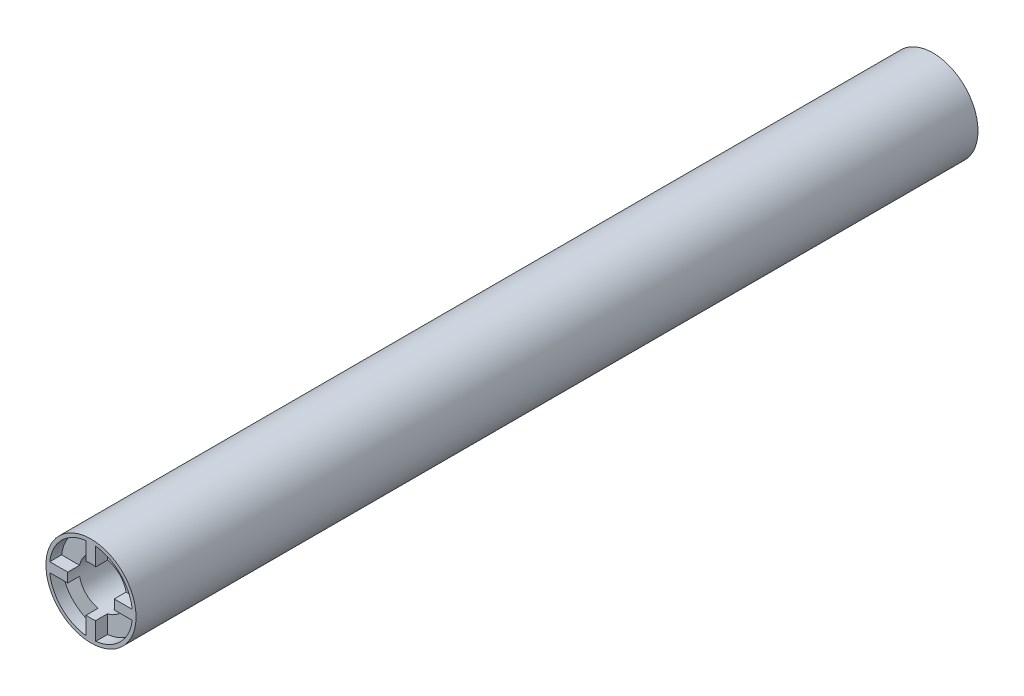
ISO-10303-21;
HEADER;
FILE_DESCRIPTION(('STEP AP214'),'2;1');
FILE_NAME('part.step','',(''),(''),'','','');
FILE_SCHEMA(('AUTOMOTIVE_DESIGN { 1 0 10303 214 1 1 1 1 }'));
ENDSEC;
DATA;
#1=APPLICATION_CONTEXT('core data for automotive mechanical design processes');
#2=APPLICATION_PROTOCOL_DEFINITION('international standard','automotive_design',2000,#1);
#3=PRODUCT_CONTEXT('',#1,'mechanical');
#4=PRODUCT('Part','Part','',(#3));
#5=PRODUCT_RELATED_PRODUCT_CATEGORY('part','',(#4));
#6=PRODUCT_DEFINITION_FORMATION('','',#4);
#7=PRODUCT_DEFINITION_CONTEXT('part definition',#1,'design');
#8=PRODUCT_DEFINITION('design','',#6,#7);
#9=PRODUCT_DEFINITION_SHAPE('','',#8);
#10=(LENGTH_UNIT() NAMED_UNIT(*) SI_UNIT(.MILLI.,.METRE.));
#11=(NAMED_UNIT(*) PLANE_ANGLE_UNIT() SI_UNIT($,.RADIAN.));
#12=(NAMED_UNIT(*) SI_UNIT($,.STERADIAN.) SOLID_ANGLE_UNIT());
#13=UNCERTAINTY_MEASURE_WITH_UNIT(LENGTH_MEASURE(1.E-05),#10,'distance_accuracy_value','');
#14=(GEOMETRIC_REPRESENTATION_CONTEXT(3) GLOBAL_UNCERTAINTY_ASSIGNED_CONTEXT((#13)) GLOBAL_UNIT_ASSIGNED_CONTEXT((#10,
#11,#12)) REPRESENTATION_CONTEXT('',''));
#15=CARTESIAN_POINT('',(0.,0.,0.));
#16=DIRECTION('',(0.,0.,1.));
#17=DIRECTION('',(1.,0.,0.));
#18=AXIS2_PLACEMENT_3D('',#15,#16,#17);
#19=CARTESIAN_POINT('',(0.,0.,0.));
#20=DIRECTION('',(0.,0.,1.));
#21=DIRECTION('',(1.,0.,0.));
#22=AXIS2_PLACEMENT_3D('',#19,#20,#21);
#23=PLANE('',#22);
#24=CARTESIAN_POINT('',(0.,0.,0.));
#25=DIRECTION('',(0.,0.,1.));
#26=DIRECTION('',(1.,0.,0.));
#27=AXIS2_PLACEMENT_3D('',#24,#25,#26);
#28=CIRCLE('',#27,1.);
#29=CARTESIAN_POINT('',(0.2,-0.979795897113271,0.));
#30=VERTEX_POINT('',#29);
#31=CARTESIAN_POINT('',(0.979795897113271,-0.2,0.));
#32=VERTEX_POINT('',#31);
#33=EDGE_CURVE('E157',#30,#32,#28,.T.);
#34=ORIENTED_EDGE('',*,*,#33,.F.);
#35=DIRECTION('',(0.,-1.,0.));
#36=VECTOR('',#35,1.);
#37=CARTESIAN_POINT('',(0.2,0.,0.));
#38=LINE('',#37,#36);
#39=CARTESIAN_POINT('',(0.2,-1.73853386507137,0.));
#40=VERTEX_POINT('',#39);
#41=EDGE_CURVE('E50',#30,#40,#38,.T.);
#42=ORIENTED_EDGE('',*,*,#41,.T.);
#43=CARTESIAN_POINT('',(0.,0.,0.));
#44=DIRECTION('',(0.,0.,1.));
#45=DIRECTION('',(1.,0.,0.));
#46=AXIS2_PLACEMENT_3D('',#43,#44,#45);
#47=CIRCLE('',#46,1.75);
#48=CARTESIAN_POINT('',(1.73853386507137,-0.2,0.));
#49=VERTEX_POINT('',#48);
#50=EDGE_CURVE('E55',#40,#49,#47,.T.);
#51=ORIENTED_EDGE('',*,*,#50,.T.);
#52=DIRECTION('',(1.,0.,0.));
#53=VECTOR('',#52,1.);
#54=CARTESIAN_POINT('',(0.,-0.2,0.));
#55=LINE('',#54,#53);
#56=EDGE_CURVE('E230',#32,#49,#55,.T.);
#57=ORIENTED_EDGE('',*,*,#56,.F.);
#58=EDGE_LOOP('',(#34,#42,#51,#57));
#59=FACE_BOUND('',#58,.T.);
#60=ADVANCED_FACE('F35',(#59),#23,.T.);
#61=CARTESIAN_POINT('',(0.979795897113271,0.2,0.));
#62=VERTEX_POINT('',#61);
#63=CARTESIAN_POINT('',(0.2,0.979795897113271,0.));
#64=VERTEX_POINT('',#63);
#65=EDGE_CURVE('E277',#62,#64,#28,.T.);
#66=ORIENTED_EDGE('',*,*,#65,.F.);
#67=DIRECTION('',(1.,0.,0.));
#68=VECTOR('',#67,1.);
#69=CARTESIAN_POINT('',(0.,0.2,0.));
#70=LINE('',#69,#68);
#71=CARTESIAN_POINT('',(1.73853386507137,0.2,0.));
#72=VERTEX_POINT('',#71);
#73=EDGE_CURVE('E228',#62,#72,#70,.T.);
#74=ORIENTED_EDGE('',*,*,#73,.T.);
#75=CARTESIAN_POINT('',(0.,0.,0.));
#76=DIRECTION('',(0.,0.,1.));
#77=DIRECTION('',(1.,0.,0.));
#78=AXIS2_PLACEMENT_3D('',#75,#76,#77);
#79=CIRCLE('',#78,1.75);
#80=CARTESIAN_POINT('',(0.2,1.73853386507137,0.));
#81=VERTEX_POINT('',#80);
#82=EDGE_CURVE('E226',#72,#81,#79,.T.);
#83=ORIENTED_EDGE('',*,*,#82,.T.);
#84=DIRECTION('',(0.,-1.,0.));
#85=VECTOR('',#84,1.);
#86=CARTESIAN_POINT('',(0.2,0.,0.));
#87=LINE('',#86,#85);
#88=EDGE_CURVE('E224',#81,#64,#87,.T.);
#89=ORIENTED_EDGE('',*,*,#88,.T.);
#90=EDGE_LOOP('',(#66,#74,#83,#89));
#91=FACE_BOUND('',#90,.T.);
#92=ADVANCED_FACE('F303',(#91),#23,.T.);
#93=DIRECTION('',(0.,-1.,0.));
#94=VECTOR('',#93,1.);
#95=CARTESIAN_POINT('',(-0.2,0.,0.));
#96=LINE('',#95,#94);
#97=CARTESIAN_POINT('',(-0.2,1.73853386507137,0.));
#98=VERTEX_POINT('',#97);
#99=CARTESIAN_POINT('',(-0.2,0.979795897113271,0.));
#100=VERTEX_POINT('',#99);
#101=EDGE_CURVE('E221',#98,#100,#96,.T.);
#102=ORIENTED_EDGE('',*,*,#101,.F.);
#103=CARTESIAN_POINT('',(0.,0.,0.));
#104=DIRECTION('',(0.,0.,1.));
#105=DIRECTION('',(1.,0.,0.));
#106=AXIS2_PLACEMENT_3D('',#103,#104,#105);
#107=CIRCLE('',#106,1.75);
#108=CARTESIAN_POINT('',(-1.73853386507137,0.2,0.));
#109=VERTEX_POINT('',#108);
#110=EDGE_CURVE('E219',#98,#109,#107,.T.);
#111=ORIENTED_EDGE('',*,*,#110,.T.);
#112=DIRECTION('',(1.,0.,0.));
#113=VECTOR('',#112,1.);
#114=CARTESIAN_POINT('',(0.,0.2,0.));
#115=LINE('',#114,#113);
#116=CARTESIAN_POINT('',(-0.979795897113271,0.2,0.));
#117=VERTEX_POINT('',#116);
#118=EDGE_CURVE('E217',#109,#117,#115,.T.);
#119=ORIENTED_EDGE('',*,*,#118,.T.);
#120=EDGE_CURVE('E279',#100,#117,#28,.T.);
#121=ORIENTED_EDGE('',*,*,#120,.F.);
#122=EDGE_LOOP('',(#102,#111,#119,#121));
#123=FACE_BOUND('',#122,.T.);
#124=ADVANCED_FACE('F308',(#123),#23,.T.);
#125=DIRECTION('',(0.,-1.,0.));
#126=VECTOR('',#125,1.);
#127=CARTESIAN_POINT('',(-0.2,0.,0.));
#128=LINE('',#127,#126);
#129=CARTESIAN_POINT('',(-0.2,-0.979795897113271,0.));
#130=VERTEX_POINT('',#129);
#131=CARTESIAN_POINT('',(-0.2,-1.73853386507137,0.));
#132=VERTEX_POINT('',#131);
#133=EDGE_CURVE('E175',#130,#132,#128,.T.);
#134=ORIENTED_EDGE('',*,*,#133,.F.);
#135=CARTESIAN_POINT('',(-0.979795897113271,-0.2,0.));
#136=VERTEX_POINT('',#135);
#137=EDGE_CURVE('E283',#136,#130,#28,.T.);
#138=ORIENTED_EDGE('',*,*,#137,.F.);
#139=DIRECTION('',(1.,0.,0.));
#140=VECTOR('',#139,1.);
#141=CARTESIAN_POINT('',(0.,-0.2,0.));
#142=LINE('',#141,#140);
#143=CARTESIAN_POINT('',(-1.73853386507137,-0.2,0.));
#144=VERTEX_POINT('',#143);
#145=EDGE_CURVE('E215',#144,#136,#142,.T.);
#146=ORIENTED_EDGE('',*,*,#145,.F.);
#147=CARTESIAN_POINT('',(0.,0.,0.));
#148=DIRECTION('',(0.,0.,1.));
#149=DIRECTION('',(1.,0.,0.));
#150=AXIS2_PLACEMENT_3D('',#147,#148,#149);
#151=CIRCLE('',#150,1.75);
#152=EDGE_CURVE('E154',#144,#132,#151,.T.);
#153=ORIENTED_EDGE('',*,*,#152,.T.);
#154=EDGE_LOOP('',(#134,#138,#146,#153));
#155=FACE_BOUND('',#154,.T.);
#156=ADVANCED_FACE('F304',(#155),#23,.T.);
#157=CARTESIAN_POINT('',(0.,0.,-8.));
#158=DIRECTION('',(0.,0.,1.));
#159=DIRECTION('',(1.,0.,0.));
#160=AXIS2_PLACEMENT_3D('',#157,#158,#159);
#161=CYLINDRICAL_SURFACE('',#160,1.);
#162=CARTESIAN_POINT('',(0.,0.,-8.));
#163=DIRECTION('',(0.,0.,1.));
#164=DIRECTION('',(1.,0.,0.));
#165=AXIS2_PLACEMENT_3D('',#162,#163,#164);
#166=CIRCLE('',#165,1.);
#167=CARTESIAN_POINT('',(1.,0.,-8.));
#168=VERTEX_POINT('',#167);
#169=EDGE_CURVE('E43',#168,#168,#166,.T.);
#170=ORIENTED_EDGE('',*,*,#169,.F.);
#171=EDGE_LOOP('',(#170));
#172=FACE_BOUND('',#171,.T.);
#173=ORIENTED_EDGE('',*,*,#65,.T.);
#174=DIRECTION('',(0.,0.,-1.));
#175=VECTOR('',#174,1.);
#176=CARTESIAN_POINT('',(0.2,0.979795897113271,0.5));
#177=LINE('',#176,#175);
#178=CARTESIAN_POINT('',(0.2,0.979795897113271,0.5));
#179=VERTEX_POINT('',#178);
#180=EDGE_CURVE('E260',#179,#64,#177,.T.);
#181=ORIENTED_EDGE('',*,*,#180,.F.);
#182=CARTESIAN_POINT('',(0.,0.,0.5));
#183=DIRECTION('',(0.,0.,1.));
#184=DIRECTION('',(1.,0.,0.));
#185=AXIS2_PLACEMENT_3D('',#182,#183,#184);
#186=CIRCLE('',#185,1.);
#187=CARTESIAN_POINT('',(-0.2,0.979795897113271,0.5));
#188=VERTEX_POINT('',#187);
#189=EDGE_CURVE('E188',#188,#179,#186,.F.);
#190=ORIENTED_EDGE('',*,*,#189,.F.);
#191=DIRECTION('',(0.,0.,-1.));
#192=VECTOR('',#191,1.);
#193=CARTESIAN_POINT('',(-0.2,0.979795897113271,0.5));
#194=LINE('',#193,#192);
#195=EDGE_CURVE('E263',#188,#100,#194,.T.);
#196=ORIENTED_EDGE('',*,*,#195,.T.);
#197=ORIENTED_EDGE('',*,*,#120,.T.);
#198=DIRECTION('',(0.,0.,-1.));
#199=VECTOR('',#198,1.);
#200=CARTESIAN_POINT('',(-0.979795897113271,0.2,0.5));
#201=LINE('',#200,#199);
#202=CARTESIAN_POINT('',(-0.979795897113271,0.2,0.5));
#203=VERTEX_POINT('',#202);
#204=EDGE_CURVE('E272',#203,#117,#201,.T.);
#205=ORIENTED_EDGE('',*,*,#204,.F.);
#206=CARTESIAN_POINT('',(0.,0.,0.5));
#207=DIRECTION('',(0.,0.,1.));
#208=DIRECTION('',(1.,0.,0.));
#209=AXIS2_PLACEMENT_3D('',#206,#207,#208);
#210=CIRCLE('',#209,1.);
#211=CARTESIAN_POINT('',(-0.979795897113271,-0.2,0.5));
#212=VERTEX_POINT('',#211);
#213=EDGE_CURVE('E166',#212,#203,#210,.F.);
#214=ORIENTED_EDGE('',*,*,#213,.F.);
#215=DIRECTION('',(0.,0.,-1.));
#216=VECTOR('',#215,1.);
#217=CARTESIAN_POINT('',(-0.979795897113271,-0.2,0.5));
#218=LINE('',#217,#216);
#219=EDGE_CURVE('E158',#212,#136,#218,.T.);
#220=ORIENTED_EDGE('',*,*,#219,.T.);
#221=ORIENTED_EDGE('',*,*,#137,.T.);
#222=DIRECTION('',(0.,0.,-1.));
#223=VECTOR('',#222,1.);
#224=CARTESIAN_POINT('',(-0.2,-0.979795897113271,0.5));
#225=LINE('',#224,#223);
#226=CARTESIAN_POINT('',(-0.2,-0.979795897113271,0.5));
#227=VERTEX_POINT('',#226);
#228=EDGE_CURVE('E238',#227,#130,#225,.T.);
#229=ORIENTED_EDGE('',*,*,#228,.F.);
#230=CARTESIAN_POINT('',(0.,0.,0.5));
#231=DIRECTION('',(0.,0.,1.));
#232=DIRECTION('',(1.,0.,0.));
#233=AXIS2_PLACEMENT_3D('',#230,#231,#232);
#234=CIRCLE('',#233,1.);
#235=CARTESIAN_POINT('',(0.2,-0.979795897113271,0.5));
#236=VERTEX_POINT('',#235);
#237=EDGE_CURVE('E210',#236,#227,#234,.F.);
#238=ORIENTED_EDGE('',*,*,#237,.F.);
#239=DIRECTION('',(0.,0.,-1.));
#240=VECTOR('',#239,1.);
#241=CARTESIAN_POINT('',(0.2,-0.979795897113271,0.5));
#242=LINE('',#241,#240);
#243=EDGE_CURVE('E241',#236,#30,#242,.T.);
#244=ORIENTED_EDGE('',*,*,#243,.T.);
#245=ORIENTED_EDGE('',*,*,#33,.T.);
#246=DIRECTION('',(0.,0.,-1.));
#247=VECTOR('',#246,1.);
#248=CARTESIAN_POINT('',(0.979795897113271,-0.2,0.5));
#249=LINE('',#248,#247);
#250=CARTESIAN_POINT('',(0.979795897113271,-0.2,0.5));
#251=VERTEX_POINT('',#250);
#252=EDGE_CURVE('E248',#251,#32,#249,.T.);
#253=ORIENTED_EDGE('',*,*,#252,.F.);
#254=CARTESIAN_POINT('',(0.,0.,0.5));
#255=DIRECTION('',(0.,0.,1.));
#256=DIRECTION('',(1.,0.,0.));
#257=AXIS2_PLACEMENT_3D('',#254,#255,#256);
#258=CIRCLE('',#257,1.);
#259=CARTESIAN_POINT('',(0.979795897113271,0.2,0.5));
#260=VERTEX_POINT('',#259);
#261=EDGE_CURVE('E199',#260,#251,#258,.F.);
#262=ORIENTED_EDGE('',*,*,#261,.F.);
#263=DIRECTION('',(0.,0.,-1.));
#264=VECTOR('',#263,1.);
#265=CARTESIAN_POINT('',(0.979795897113271,0.2,0.5));
#266=LINE('',#265,#264);
#267=EDGE_CURVE('E251',#260,#62,#266,.T.);
#268=ORIENTED_EDGE('',*,*,#267,.T.);
#269=EDGE_LOOP('',(#173,#181,#190,#196,#197,#205,#214,#220,#221,#229,#238,#244,#245,#253,#262,#268));
#270=FACE_BOUND('',#269,.T.);
#271=ADVANCED_FACE('F288',(#172,#270),#161,.F.);
#272=CARTESIAN_POINT('',(0.,0.,-8.));
#273=DIRECTION('',(0.,0.,1.));
#274=DIRECTION('',(1.,0.,0.));
#275=AXIS2_PLACEMENT_3D('',#272,#273,#274);
#276=PLANE('',#275);
#277=ORIENTED_EDGE('',*,*,#169,.T.);
#278=EDGE_LOOP('',(#277));
#279=FACE_BOUND('',#278,.T.);
#280=ADVANCED_FACE('F316',(#279),#276,.T.);
#281=CARTESIAN_POINT('',(0.,0.,0.5));
#282=DIRECTION('',(0.,0.,-1.));
#283=DIRECTION('',(-1.,0.,0.));
#284=AXIS2_PLACEMENT_3D('',#281,#282,#283);
#285=CYLINDRICAL_SURFACE('',#284,1.75);
#286=ORIENTED_EDGE('',*,*,#152,.F.);
#287=DIRECTION('',(0.,0.,-1.));
#288=VECTOR('',#287,1.);
#289=CARTESIAN_POINT('',(-1.73853386507137,-0.2,0.5));
#290=LINE('',#289,#288);
#291=CARTESIAN_POINT('',(-1.73853386507137,-0.2,0.5));
#292=VERTEX_POINT('',#291);
#293=EDGE_CURVE('E148',#292,#144,#290,.T.);
#294=ORIENTED_EDGE('',*,*,#293,.F.);
#295=CARTESIAN_POINT('',(0.,0.,0.5));
#296=DIRECTION('',(0.,0.,1.));
#297=DIRECTION('',(1.,0.,0.));
#298=AXIS2_PLACEMENT_3D('',#295,#296,#297);
#299=CIRCLE('',#298,1.75);
#300=CARTESIAN_POINT('',(-0.2,-1.73853386507137,0.5));
#301=VERTEX_POINT('',#300);
#302=EDGE_CURVE('E153',#292,#301,#299,.T.);
#303=ORIENTED_EDGE('',*,*,#302,.T.);
#304=DIRECTION('',(0.,0.,-1.));
#305=VECTOR('',#304,1.);
#306=CARTESIAN_POINT('',(-0.2,-1.73853386507137,0.5));
#307=LINE('',#306,#305);
#308=EDGE_CURVE('E213',#301,#132,#307,.T.);
#309=ORIENTED_EDGE('',*,*,#308,.T.);
#310=EDGE_LOOP('',(#286,#294,#303,#309));
#311=FACE_BOUND('',#310,.T.);
#312=ADVANCED_FACE('F150',(#311),#285,.F.);
#313=CARTESIAN_POINT('',(0.,-0.2,0.5));
#314=DIRECTION('',(0.,1.,0.));
#315=DIRECTION('',(-1.,0.,0.));
#316=AXIS2_PLACEMENT_3D('',#313,#314,#315);
#317=PLANE('',#316);
#318=ORIENTED_EDGE('',*,*,#145,.T.);
#319=ORIENTED_EDGE('',*,*,#219,.F.);
#320=DIRECTION('',(1.,0.,0.));
#321=VECTOR('',#320,1.);
#322=CARTESIAN_POINT('',(0.,-0.2,0.5));
#323=LINE('',#322,#321);
#324=EDGE_CURVE('E162',#292,#212,#323,.T.);
#325=ORIENTED_EDGE('',*,*,#324,.F.);
#326=ORIENTED_EDGE('',*,*,#293,.T.);
#327=EDGE_LOOP('',(#318,#319,#325,#326));
#328=FACE_BOUND('',#327,.T.);
#329=ADVANCED_FACE('F163',(#328),#317,.F.);
#330=CARTESIAN_POINT('',(0.,0.2,0.5));
#331=DIRECTION('',(0.,1.,0.));
#332=DIRECTION('',(-1.,0.,0.));
#333=AXIS2_PLACEMENT_3D('',#330,#331,#332);
#334=PLANE('',#333);
#335=ORIENTED_EDGE('',*,*,#118,.F.);
#336=DIRECTION('',(0.,0.,-1.));
#337=VECTOR('',#336,1.);
#338=CARTESIAN_POINT('',(-1.73853386507137,0.2,0.5));
#339=LINE('',#338,#337);
#340=CARTESIAN_POINT('',(-1.73853386507137,0.2,0.5));
#341=VERTEX_POINT('',#340);
#342=EDGE_CURVE('E269',#341,#109,#339,.T.);
#343=ORIENTED_EDGE('',*,*,#342,.F.);
#344=DIRECTION('',(1.,0.,0.));
#345=VECTOR('',#344,1.);
#346=CARTESIAN_POINT('',(0.,0.2,0.5));
#347=LINE('',#346,#345);
#348=EDGE_CURVE('E179',#341,#203,#347,.T.);
#349=ORIENTED_EDGE('',*,*,#348,.T.);
#350=ORIENTED_EDGE('',*,*,#204,.T.);
#351=EDGE_LOOP('',(#335,#343,#349,#350));
#352=FACE_BOUND('',#351,.T.);
#353=ADVANCED_FACE('F333',(#352),#334,.T.);
#354=CARTESIAN_POINT('',(0.,0.,0.5));
#355=DIRECTION('',(0.,0.,-1.));
#356=DIRECTION('',(-1.,0.,0.));
#357=AXIS2_PLACEMENT_3D('',#354,#355,#356);
#358=CYLINDRICAL_SURFACE('',#357,1.75);
#359=ORIENTED_EDGE('',*,*,#110,.F.);
#360=DIRECTION('',(0.,0.,-1.));
#361=VECTOR('',#360,1.);
#362=CARTESIAN_POINT('',(-0.2,1.73853386507137,0.5));
#363=LINE('',#362,#361);
#364=CARTESIAN_POINT('',(-0.2,1.73853386507137,0.5));
#365=VERTEX_POINT('',#364);
#366=EDGE_CURVE('E266',#365,#98,#363,.T.);
#367=ORIENTED_EDGE('',*,*,#366,.F.);
#368=CARTESIAN_POINT('',(0.,0.,0.5));
#369=DIRECTION('',(0.,0.,1.));
#370=DIRECTION('',(1.,0.,0.));
#371=AXIS2_PLACEMENT_3D('',#368,#369,#370);
#372=CIRCLE('',#371,1.75);
#373=EDGE_CURVE('E182',#365,#341,#372,.T.);
#374=ORIENTED_EDGE('',*,*,#373,.T.);
#375=ORIENTED_EDGE('',*,*,#342,.T.);
#376=EDGE_LOOP('',(#359,#367,#374,#375));
#377=FACE_BOUND('',#376,.T.);
#378=ADVANCED_FACE('F329',(#377),#358,.F.);
#379=CARTESIAN_POINT('',(-0.2,0.,0.5));
#380=DIRECTION('',(1.,0.,0.));
#381=DIRECTION('',(0.,1.,0.));
#382=AXIS2_PLACEMENT_3D('',#379,#380,#381);
#383=PLANE('',#382);
#384=ORIENTED_EDGE('',*,*,#101,.T.);
#385=ORIENTED_EDGE('',*,*,#195,.F.);
#386=DIRECTION('',(0.,-1.,0.));
#387=VECTOR('',#386,1.);
#388=CARTESIAN_POINT('',(-0.2,0.,0.5));
#389=LINE('',#388,#387);
#390=EDGE_CURVE('E185',#365,#188,#389,.T.);
#391=ORIENTED_EDGE('',*,*,#390,.F.);
#392=ORIENTED_EDGE('',*,*,#366,.T.);
#393=EDGE_LOOP('',(#384,#385,#391,#392));
#394=FACE_BOUND('',#393,.T.);
#395=ADVANCED_FACE('F326',(#394),#383,.F.);
#396=CARTESIAN_POINT('',(0.2,0.,0.5));
#397=DIRECTION('',(1.,0.,0.));
#398=DIRECTION('',(0.,1.,0.));
#399=AXIS2_PLACEMENT_3D('',#396,#397,#398);
#400=PLANE('',#399);
#401=ORIENTED_EDGE('',*,*,#88,.F.);
#402=DIRECTION('',(0.,0.,-1.));
#403=VECTOR('',#402,1.);
#404=CARTESIAN_POINT('',(0.2,1.73853386507137,0.5));
#405=LINE('',#404,#403);
#406=CARTESIAN_POINT('',(0.2,1.73853386507137,0.5));
#407=VERTEX_POINT('',#406);
#408=EDGE_CURVE('E257',#407,#81,#405,.T.);
#409=ORIENTED_EDGE('',*,*,#408,.F.);
#410=DIRECTION('',(0.,-1.,0.));
#411=VECTOR('',#410,1.);
#412=CARTESIAN_POINT('',(0.2,0.,0.5));
#413=LINE('',#412,#411);
#414=EDGE_CURVE('E190',#407,#179,#413,.T.);
#415=ORIENTED_EDGE('',*,*,#414,.T.);
#416=ORIENTED_EDGE('',*,*,#180,.T.);
#417=EDGE_LOOP('',(#401,#409,#415,#416));
#418=FACE_BOUND('',#417,.T.);
#419=ADVANCED_FACE('F347',(#418),#400,.T.);
#420=CARTESIAN_POINT('',(0.,0.,0.5));
#421=DIRECTION('',(0.,0.,-1.));
#422=DIRECTION('',(-1.,0.,0.));
#423=AXIS2_PLACEMENT_3D('',#420,#421,#422);
#424=CYLINDRICAL_SURFACE('',#423,1.75);
#425=ORIENTED_EDGE('',*,*,#82,.F.);
#426=DIRECTION('',(0.,0.,-1.));
#427=VECTOR('',#426,1.);
#428=CARTESIAN_POINT('',(1.73853386507137,0.2,0.5));
#429=LINE('',#428,#427);
#430=CARTESIAN_POINT('',(1.73853386507137,0.2,0.5));
#431=VERTEX_POINT('',#430);
#432=EDGE_CURVE('E254',#431,#72,#429,.T.);
#433=ORIENTED_EDGE('',*,*,#432,.F.);
#434=CARTESIAN_POINT('',(0.,0.,0.5));
#435=DIRECTION('',(0.,0.,1.));
#436=DIRECTION('',(1.,0.,0.));
#437=AXIS2_PLACEMENT_3D('',#434,#435,#436);
#438=CIRCLE('',#437,1.75);
#439=EDGE_CURVE('E193',#431,#407,#438,.T.);
#440=ORIENTED_EDGE('',*,*,#439,.T.);
#441=ORIENTED_EDGE('',*,*,#408,.T.);
#442=EDGE_LOOP('',(#425,#433,#440,#441));
#443=FACE_BOUND('',#442,.T.);
#444=ADVANCED_FACE('F341',(#443),#424,.F.);
#445=CARTESIAN_POINT('',(0.,0.2,0.5));
#446=DIRECTION('',(0.,1.,0.));
#447=DIRECTION('',(0.,0.,1.));
#448=AXIS2_PLACEMENT_3D('',#445,#446,#447);
#449=PLANE('',#448);
#450=ORIENTED_EDGE('',*,*,#73,.F.);
#451=ORIENTED_EDGE('',*,*,#267,.F.);
#452=DIRECTION('',(1.,0.,0.));
#453=VECTOR('',#452,1.);
#454=CARTESIAN_POINT('',(0.,0.2,0.5));
#455=LINE('',#454,#453);
#456=EDGE_CURVE('E196',#260,#431,#455,.T.);
#457=ORIENTED_EDGE('',*,*,#456,.T.);
#458=ORIENTED_EDGE('',*,*,#432,.T.);
#459=EDGE_LOOP('',(#450,#451,#457,#458));
#460=FACE_BOUND('',#459,.T.);
#461=ADVANCED_FACE('F345',(#460),#449,.T.);
#462=CARTESIAN_POINT('',(0.,-0.2,0.5));
#463=DIRECTION('',(0.,1.,0.));
#464=DIRECTION('',(0.,0.,1.));
#465=AXIS2_PLACEMENT_3D('',#462,#463,#464);
#466=PLANE('',#465);
#467=ORIENTED_EDGE('',*,*,#56,.T.);
#468=DIRECTION('',(0.,0.,-1.));
#469=VECTOR('',#468,1.);
#470=CARTESIAN_POINT('',(1.73853386507137,-0.2,0.5));
#471=LINE('',#470,#469);
#472=CARTESIAN_POINT('',(1.73853386507137,-0.2,0.5));
#473=VERTEX_POINT('',#472);
#474=EDGE_CURVE('E246',#473,#49,#471,.T.);
#475=ORIENTED_EDGE('',*,*,#474,.F.);
#476=DIRECTION('',(1.,0.,0.));
#477=VECTOR('',#476,1.);
#478=CARTESIAN_POINT('',(0.,-0.2,0.5));
#479=LINE('',#478,#477);
#480=EDGE_CURVE('E202',#251,#473,#479,.T.);
#481=ORIENTED_EDGE('',*,*,#480,.F.);
#482=ORIENTED_EDGE('',*,*,#252,.T.);
#483=EDGE_LOOP('',(#467,#475,#481,#482));
#484=FACE_BOUND('',#483,.T.);
#485=ADVANCED_FACE('F301',(#484),#466,.F.);
#486=CARTESIAN_POINT('',(0.,0.,0.5));
#487=DIRECTION('',(0.,0.,-1.));
#488=DIRECTION('',(-1.,0.,0.));
#489=AXIS2_PLACEMENT_3D('',#486,#487,#488);
#490=CYLINDRICAL_SURFACE('',#489,1.75);
#491=ORIENTED_EDGE('',*,*,#50,.F.);
#492=DIRECTION('',(0.,0.,-1.));
#493=VECTOR('',#492,1.);
#494=CARTESIAN_POINT('',(0.2,-1.73853386507137,0.5));
#495=LINE('',#494,#493);
#496=CARTESIAN_POINT('',(0.2,-1.73853386507137,0.5));
#497=VERTEX_POINT('',#496);
#498=EDGE_CURVE('E244',#497,#40,#495,.T.);
#499=ORIENTED_EDGE('',*,*,#498,.F.);
#500=CARTESIAN_POINT('',(0.,0.,0.5));
#501=DIRECTION('',(0.,0.,1.));
#502=DIRECTION('',(1.,0.,0.));
#503=AXIS2_PLACEMENT_3D('',#500,#501,#502);
#504=CIRCLE('',#503,1.75);
#505=EDGE_CURVE('E204',#497,#473,#504,.T.);
#506=ORIENTED_EDGE('',*,*,#505,.T.);
#507=ORIENTED_EDGE('',*,*,#474,.T.);
#508=EDGE_LOOP('',(#491,#499,#506,#507));
#509=FACE_BOUND('',#508,.T.);
#510=ADVANCED_FACE('F298',(#509),#490,.F.);
#511=CARTESIAN_POINT('',(0.2,0.,0.5));
#512=DIRECTION('',(1.,0.,0.));
#513=DIRECTION('',(0.,1.,0.));
#514=AXIS2_PLACEMENT_3D('',#511,#512,#513);
#515=PLANE('',#514);
#516=ORIENTED_EDGE('',*,*,#41,.F.);
#517=ORIENTED_EDGE('',*,*,#243,.F.);
#518=DIRECTION('',(0.,-1.,0.));
#519=VECTOR('',#518,1.);
#520=CARTESIAN_POINT('',(0.2,0.,0.5));
#521=LINE('',#520,#519);
#522=EDGE_CURVE('E207',#236,#497,#521,.T.);
#523=ORIENTED_EDGE('',*,*,#522,.T.);
#524=ORIENTED_EDGE('',*,*,#498,.T.);
#525=EDGE_LOOP('',(#516,#517,#523,#524));
#526=FACE_BOUND('',#525,.T.);
#527=ADVANCED_FACE('F296',(#526),#515,.T.);
#528=CARTESIAN_POINT('',(-0.2,0.,0.5));
#529=DIRECTION('',(1.,0.,0.));
#530=DIRECTION('',(0.,1.,0.));
#531=AXIS2_PLACEMENT_3D('',#528,#529,#530);
#532=PLANE('',#531);
#533=ORIENTED_EDGE('',*,*,#133,.T.);
#534=ORIENTED_EDGE('',*,*,#308,.F.);
#535=DIRECTION('',(0.,-1.,0.));
#536=VECTOR('',#535,1.);
#537=CARTESIAN_POINT('',(-0.2,0.,0.5));
#538=LINE('',#537,#536);
#539=EDGE_CURVE('E170',#227,#301,#538,.T.);
#540=ORIENTED_EDGE('',*,*,#539,.F.);
#541=ORIENTED_EDGE('',*,*,#228,.T.);
#542=EDGE_LOOP('',(#533,#534,#540,#541));
#543=FACE_BOUND('',#542,.T.);
#544=ADVANCED_FACE('F292',(#543),#532,.F.);
#545=CARTESIAN_POINT('',(0.,0.,0.5));
#546=DIRECTION('',(0.,0.,1.));
#547=DIRECTION('',(1.,0.,0.));
#548=AXIS2_PLACEMENT_3D('',#545,#546,#547);
#549=PLANE('',#548);
#550=CARTESIAN_POINT('',(0.,0.,0.5));
#551=DIRECTION('',(0.,0.,1.));
#552=DIRECTION('',(1.,0.,0.));
#553=AXIS2_PLACEMENT_3D('',#550,#551,#552);
#554=CIRCLE('',#553,1.9);
#555=CARTESIAN_POINT('',(1.9,0.,0.5));
#556=VERTEX_POINT('',#555);
#557=EDGE_CURVE('E172',#556,#556,#554,.T.);
#558=ORIENTED_EDGE('',*,*,#557,.T.);
#559=EDGE_LOOP('',(#558));
#560=FACE_BOUND('',#559,.T.);
#561=ORIENTED_EDGE('',*,*,#302,.F.);
#562=ORIENTED_EDGE('',*,*,#324,.T.);
#563=ORIENTED_EDGE('',*,*,#213,.T.);
#564=ORIENTED_EDGE('',*,*,#348,.F.);
#565=ORIENTED_EDGE('',*,*,#373,.F.);
#566=ORIENTED_EDGE('',*,*,#390,.T.);
#567=ORIENTED_EDGE('',*,*,#189,.T.);
#568=ORIENTED_EDGE('',*,*,#414,.F.);
#569=ORIENTED_EDGE('',*,*,#439,.F.);
#570=ORIENTED_EDGE('',*,*,#456,.F.);
#571=ORIENTED_EDGE('',*,*,#261,.T.);
#572=ORIENTED_EDGE('',*,*,#480,.T.);
#573=ORIENTED_EDGE('',*,*,#505,.F.);
#574=ORIENTED_EDGE('',*,*,#522,.F.);
#575=ORIENTED_EDGE('',*,*,#237,.T.);
#576=ORIENTED_EDGE('',*,*,#539,.T.);
#577=EDGE_LOOP('',(#561,#562,#563,#564,#565,#566,#567,#568,#569,#570,#571,#572,#573,#574,#575,#576));
#578=FACE_BOUND('',#577,.T.);
#579=ADVANCED_FACE('F168',(#560,#578),#549,.T.);
#580=CARTESIAN_POINT('',(0.,0.,-35.));
#581=DIRECTION('',(0.,0.,1.));
#582=DIRECTION('',(1.,0.,0.));
#583=AXIS2_PLACEMENT_3D('',#580,#581,#582);
#584=PLANE('',#583);
#585=CARTESIAN_POINT('',(0.,0.,-35.));
#586=DIRECTION('',(0.,0.,1.));
#587=DIRECTION('',(1.,0.,0.));
#588=AXIS2_PLACEMENT_3D('',#585,#586,#587);
#589=CIRCLE('',#588,1.9);
#590=CARTESIAN_POINT('',(1.9,0.,-35.));
#591=VERTEX_POINT('',#590);
#592=EDGE_CURVE('E11',#591,#591,#589,.T.);
#593=ORIENTED_EDGE('',*,*,#592,.F.);
#594=EDGE_LOOP('',(#593));
#595=FACE_BOUND('',#594,.T.);
#596=ADVANCED_FACE('F368',(#595),#584,.F.);
#597=CARTESIAN_POINT('',(0.,0.,-35.));
#598=DIRECTION('',(0.,0.,1.));
#599=DIRECTION('',(1.,0.,0.));
#600=AXIS2_PLACEMENT_3D('',#597,#598,#599);
#601=CYLINDRICAL_SURFACE('',#600,1.9);
#602=ORIENTED_EDGE('',*,*,#592,.T.);
#603=EDGE_LOOP('',(#602));
#604=FACE_BOUND('',#603,.T.);
#605=ORIENTED_EDGE('',*,*,#557,.F.);
#606=EDGE_LOOP('',(#605));
#607=FACE_BOUND('',#606,.T.);
#608=ADVANCED_FACE('F37',(#604,#607),#601,.T.);
#609=CLOSED_SHELL('',(#60,#92,#124,#156,#271,#280,#312,#329,#353,#378,#395,#419,#444,#461,#485,
#510,#527,#544,#579,#596,#608));
#610=MANIFOLD_SOLID_BREP('B2',#609);
#611=ADVANCED_BREP_SHAPE_REPRESENTATION('',(#18,#610),#14);
#612=SHAPE_DEFINITION_REPRESENTATION(#9,#611);
ENDSEC;
END-ISO-10303-21;
